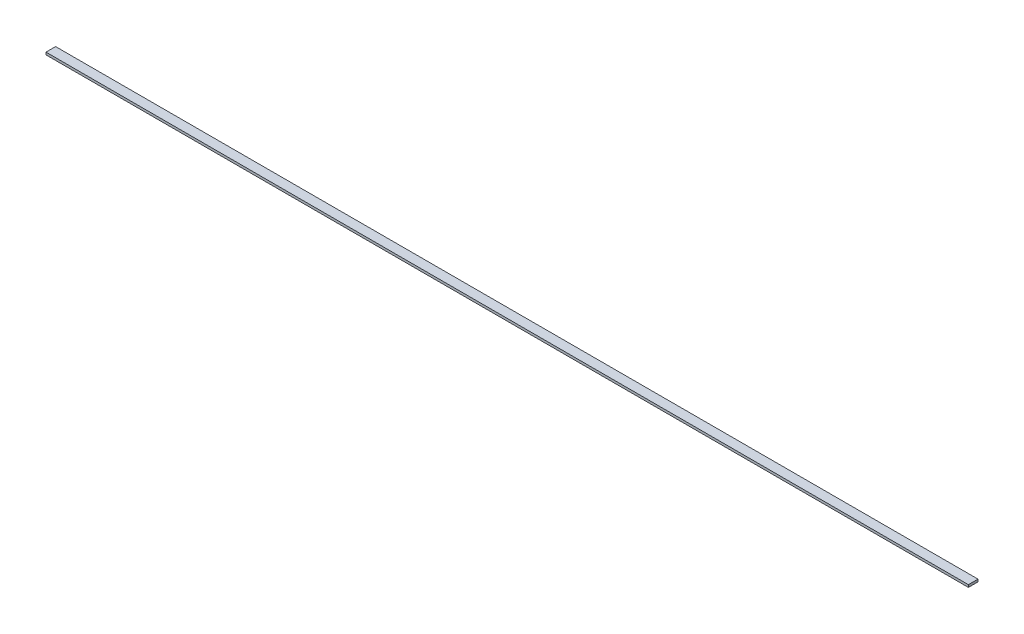
ISO-10303-21;
HEADER;
FILE_DESCRIPTION(('STEP AP214'),'2;1');
FILE_NAME('part.step','',(''),(''),'','','');
FILE_SCHEMA(('AUTOMOTIVE_DESIGN { 1 0 10303 214 1 1 1 1 }'));
ENDSEC;
DATA;
#1=APPLICATION_CONTEXT('core data for automotive mechanical design processes');
#2=APPLICATION_PROTOCOL_DEFINITION('international standard','automotive_design',2000,#1);
#3=PRODUCT_CONTEXT('',#1,'mechanical');
#4=PRODUCT('Part','Part','',(#3));
#5=PRODUCT_RELATED_PRODUCT_CATEGORY('part','',(#4));
#6=PRODUCT_DEFINITION_FORMATION('','',#4);
#7=PRODUCT_DEFINITION_CONTEXT('part definition',#1,'design');
#8=PRODUCT_DEFINITION('design','',#6,#7);
#9=PRODUCT_DEFINITION_SHAPE('','',#8);
#10=(LENGTH_UNIT() NAMED_UNIT(*) SI_UNIT(.MILLI.,.METRE.));
#11=(NAMED_UNIT(*) PLANE_ANGLE_UNIT() SI_UNIT($,.RADIAN.));
#12=(NAMED_UNIT(*) SI_UNIT($,.STERADIAN.) SOLID_ANGLE_UNIT());
#13=UNCERTAINTY_MEASURE_WITH_UNIT(LENGTH_MEASURE(1.E-05),#10,'distance_accuracy_value','');
#14=(GEOMETRIC_REPRESENTATION_CONTEXT(3) GLOBAL_UNCERTAINTY_ASSIGNED_CONTEXT((#13)) GLOBAL_UNIT_ASSIGNED_CONTEXT((#10,
#11,#12)) REPRESENTATION_CONTEXT('',''));
#15=CARTESIAN_POINT('',(0.,0.,0.));
#16=DIRECTION('',(0.,0.,1.));
#17=DIRECTION('',(1.,0.,0.));
#18=AXIS2_PLACEMENT_3D('',#15,#16,#17);
#19=CARTESIAN_POINT('',(1219.2,6.35,12.7));
#20=DIRECTION('',(-1.,0.,0.));
#21=DIRECTION('',(0.,0.,1.));
#22=AXIS2_PLACEMENT_3D('',#19,#20,#21);
#23=PLANE('',#22);
#24=DIRECTION('',(0.,0.,-1.));
#25=VECTOR('',#24,1.);
#26=CARTESIAN_POINT('',(1219.2,0.,12.7));
#27=LINE('',#26,#25);
#28=CARTESIAN_POINT('',(1219.2,0.,12.7));
#29=VERTEX_POINT('',#28);
#30=CARTESIAN_POINT('',(1219.2,0.,-12.7));
#31=VERTEX_POINT('',#30);
#32=EDGE_CURVE('E98',#29,#31,#27,.T.);
#33=ORIENTED_EDGE('',*,*,#32,.T.);
#34=DIRECTION('',(0.,-1.,0.));
#35=VECTOR('',#34,1.);
#36=CARTESIAN_POINT('',(1219.2,6.35,-12.7));
#37=LINE('',#36,#35);
#38=CARTESIAN_POINT('',(1219.2,6.35,-12.7));
#39=VERTEX_POINT('',#38);
#40=EDGE_CURVE('E11',#39,#31,#37,.T.);
#41=ORIENTED_EDGE('',*,*,#40,.F.);
#42=DIRECTION('',(0.,0.,-1.));
#43=VECTOR('',#42,1.);
#44=CARTESIAN_POINT('',(1219.2,6.35,12.7));
#45=LINE('',#44,#43);
#46=CARTESIAN_POINT('',(1219.2,6.35,12.7));
#47=VERTEX_POINT('',#46);
#48=EDGE_CURVE('E86',#47,#39,#45,.T.);
#49=ORIENTED_EDGE('',*,*,#48,.F.);
#50=DIRECTION('',(0.,-1.,0.));
#51=VECTOR('',#50,1.);
#52=CARTESIAN_POINT('',(1219.2,6.35,12.7));
#53=LINE('',#52,#51);
#54=EDGE_CURVE('E94',#47,#29,#53,.T.);
#55=ORIENTED_EDGE('',*,*,#54,.T.);
#56=EDGE_LOOP('',(#33,#41,#49,#55));
#57=FACE_BOUND('',#56,.T.);
#58=ADVANCED_FACE('F35',(#57),#23,.F.);
#59=CARTESIAN_POINT('',(-1219.2,6.35,-12.7));
#60=DIRECTION('',(0.,0.,1.));
#61=DIRECTION('',(1.,0.,0.));
#62=AXIS2_PLACEMENT_3D('',#59,#60,#61);
#63=PLANE('',#62);
#64=DIRECTION('',(-1.,0.,0.));
#65=VECTOR('',#64,1.);
#66=CARTESIAN_POINT('',(-1219.2,0.,-12.7));
#67=LINE('',#66,#65);
#68=CARTESIAN_POINT('',(-1219.2,0.,-12.7));
#69=VERTEX_POINT('',#68);
#70=EDGE_CURVE('E90',#31,#69,#67,.T.);
#71=ORIENTED_EDGE('',*,*,#70,.T.);
#72=DIRECTION('',(0.,-1.,0.));
#73=VECTOR('',#72,1.);
#74=CARTESIAN_POINT('',(-1219.2,6.35,-12.7));
#75=LINE('',#74,#73);
#76=CARTESIAN_POINT('',(-1219.2,6.35,-12.7));
#77=VERTEX_POINT('',#76);
#78=EDGE_CURVE('E43',#77,#69,#75,.T.);
#79=ORIENTED_EDGE('',*,*,#78,.F.);
#80=DIRECTION('',(-1.,0.,0.));
#81=VECTOR('',#80,1.);
#82=CARTESIAN_POINT('',(-1219.2,6.35,-12.7));
#83=LINE('',#82,#81);
#84=EDGE_CURVE('E81',#39,#77,#83,.T.);
#85=ORIENTED_EDGE('',*,*,#84,.F.);
#86=ORIENTED_EDGE('',*,*,#40,.T.);
#87=EDGE_LOOP('',(#71,#79,#85,#86));
#88=FACE_BOUND('',#87,.T.);
#89=ADVANCED_FACE('F89',(#88),#63,.F.);
#90=CARTESIAN_POINT('',(-1219.2,6.35,12.7));
#91=DIRECTION('',(1.,0.,0.));
#92=DIRECTION('',(0.,0.,-1.));
#93=AXIS2_PLACEMENT_3D('',#90,#91,#92);
#94=PLANE('',#93);
#95=DIRECTION('',(0.,0.,1.));
#96=VECTOR('',#95,1.);
#97=CARTESIAN_POINT('',(-1219.2,0.,12.7));
#98=LINE('',#97,#96);
#99=CARTESIAN_POINT('',(-1219.2,0.,12.7));
#100=VERTEX_POINT('',#99);
#101=EDGE_CURVE('E68',#69,#100,#98,.T.);
#102=ORIENTED_EDGE('',*,*,#101,.T.);
#103=DIRECTION('',(0.,-1.,0.));
#104=VECTOR('',#103,1.);
#105=CARTESIAN_POINT('',(-1219.2,6.35,12.7));
#106=LINE('',#105,#104);
#107=CARTESIAN_POINT('',(-1219.2,6.35,12.7));
#108=VERTEX_POINT('',#107);
#109=EDGE_CURVE('E91',#108,#100,#106,.T.);
#110=ORIENTED_EDGE('',*,*,#109,.F.);
#111=DIRECTION('',(0.,0.,1.));
#112=VECTOR('',#111,1.);
#113=CARTESIAN_POINT('',(-1219.2,6.35,12.7));
#114=LINE('',#113,#112);
#115=EDGE_CURVE('E84',#77,#108,#114,.T.);
#116=ORIENTED_EDGE('',*,*,#115,.F.);
#117=ORIENTED_EDGE('',*,*,#78,.T.);
#118=EDGE_LOOP('',(#102,#110,#116,#117));
#119=FACE_BOUND('',#118,.T.);
#120=ADVANCED_FACE('F92',(#119),#94,.F.);
#121=CARTESIAN_POINT('',(-1219.2,6.35,12.7));
#122=DIRECTION('',(0.,0.,-1.));
#123=DIRECTION('',(-1.,0.,0.));
#124=AXIS2_PLACEMENT_3D('',#121,#122,#123);
#125=PLANE('',#124);
#126=DIRECTION('',(1.,0.,0.));
#127=VECTOR('',#126,1.);
#128=CARTESIAN_POINT('',(-1219.2,0.,12.7));
#129=LINE('',#128,#127);
#130=EDGE_CURVE('E74',#100,#29,#129,.T.);
#131=ORIENTED_EDGE('',*,*,#130,.T.);
#132=ORIENTED_EDGE('',*,*,#54,.F.);
#133=DIRECTION('',(1.,0.,0.));
#134=VECTOR('',#133,1.);
#135=CARTESIAN_POINT('',(-1219.2,6.35,12.7));
#136=LINE('',#135,#134);
#137=EDGE_CURVE('E51',#108,#47,#136,.T.);
#138=ORIENTED_EDGE('',*,*,#137,.F.);
#139=ORIENTED_EDGE('',*,*,#109,.T.);
#140=EDGE_LOOP('',(#131,#132,#138,#139));
#141=FACE_BOUND('',#140,.T.);
#142=ADVANCED_FACE('F105',(#141),#125,.F.);
#143=CARTESIAN_POINT('',(0.,6.35,0.));
#144=DIRECTION('',(0.,-1.,0.));
#145=DIRECTION('',(0.,0.,-1.));
#146=AXIS2_PLACEMENT_3D('',#143,#144,#145);
#147=PLANE('',#146);
#148=ORIENTED_EDGE('',*,*,#48,.T.);
#149=ORIENTED_EDGE('',*,*,#84,.T.);
#150=ORIENTED_EDGE('',*,*,#115,.T.);
#151=ORIENTED_EDGE('',*,*,#137,.T.);
#152=EDGE_LOOP('',(#148,#149,#150,#151));
#153=FACE_BOUND('',#152,.T.);
#154=ADVANCED_FACE('F82',(#153),#147,.F.);
#155=CARTESIAN_POINT('',(0.,0.,0.));
#156=DIRECTION('',(0.,-1.,0.));
#157=DIRECTION('',(0.,0.,-1.));
#158=AXIS2_PLACEMENT_3D('',#155,#156,#157);
#159=PLANE('',#158);
#160=ORIENTED_EDGE('',*,*,#32,.F.);
#161=ORIENTED_EDGE('',*,*,#130,.F.);
#162=ORIENTED_EDGE('',*,*,#101,.F.);
#163=ORIENTED_EDGE('',*,*,#70,.F.);
#164=EDGE_LOOP('',(#160,#161,#162,#163));
#165=FACE_BOUND('',#164,.T.);
#166=ADVANCED_FACE('F108',(#165),#159,.T.);
#167=CLOSED_SHELL('',(#58,#89,#120,#142,#154,#166));
#168=MANIFOLD_SOLID_BREP('B2',#167);
#169=ADVANCED_BREP_SHAPE_REPRESENTATION('',(#18,#168),#14);
#170=SHAPE_DEFINITION_REPRESENTATION(#9,#169);
ENDSEC;
END-ISO-10303-21;
